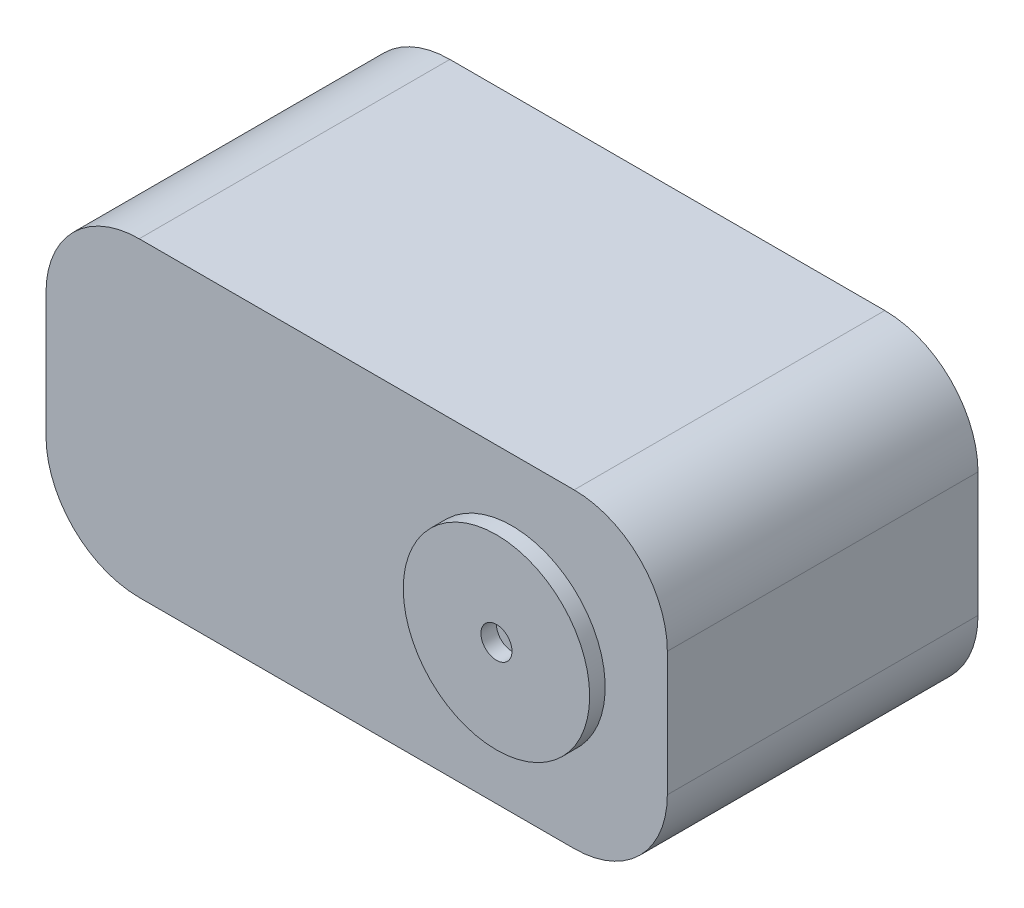
ISO-10303-21;
HEADER;
FILE_DESCRIPTION(('STEP AP214'),'2;1');
FILE_NAME('part.step','',(''),(''),'','','');
FILE_SCHEMA(('AUTOMOTIVE_DESIGN { 1 0 10303 214 1 1 1 1 }'));
ENDSEC;
DATA;
#1=APPLICATION_CONTEXT('core data for automotive mechanical design processes');
#2=APPLICATION_PROTOCOL_DEFINITION('international standard','automotive_design',2000,#1);
#3=PRODUCT_CONTEXT('',#1,'mechanical');
#4=PRODUCT('Part','Part','',(#3));
#5=PRODUCT_RELATED_PRODUCT_CATEGORY('part','',(#4));
#6=PRODUCT_DEFINITION_FORMATION('','',#4);
#7=PRODUCT_DEFINITION_CONTEXT('part definition',#1,'design');
#8=PRODUCT_DEFINITION('design','',#6,#7);
#9=PRODUCT_DEFINITION_SHAPE('','',#8);
#10=(LENGTH_UNIT() NAMED_UNIT(*) SI_UNIT(.MILLI.,.METRE.));
#11=(NAMED_UNIT(*) PLANE_ANGLE_UNIT() SI_UNIT($,.RADIAN.));
#12=(NAMED_UNIT(*) SI_UNIT($,.STERADIAN.) SOLID_ANGLE_UNIT());
#13=UNCERTAINTY_MEASURE_WITH_UNIT(LENGTH_MEASURE(1.E-05),#10,'distance_accuracy_value','');
#14=(GEOMETRIC_REPRESENTATION_CONTEXT(3) GLOBAL_UNCERTAINTY_ASSIGNED_CONTEXT((#13)) GLOBAL_UNIT_ASSIGNED_CONTEXT((#10,
#11,#12)) REPRESENTATION_CONTEXT('',''));
#15=CARTESIAN_POINT('',(0.,0.,0.));
#16=DIRECTION('',(0.,0.,1.));
#17=DIRECTION('',(1.,0.,0.));
#18=AXIS2_PLACEMENT_3D('',#15,#16,#17);
#19=CARTESIAN_POINT('',(-17.7799999999999,12.7,25.4));
#20=DIRECTION('',(0.,1.,0.));
#21=DIRECTION('',(0.,0.,1.));
#22=AXIS2_PLACEMENT_3D('',#19,#20,#21);
#23=PLANE('',#22);
#24=DIRECTION('',(1.,0.,0.));
#25=VECTOR('',#24,1.);
#26=CARTESIAN_POINT('',(-17.7799999999999,12.7,0.));
#27=LINE('',#26,#25);
#28=CARTESIAN_POINT('',(-17.7799999999999,12.7,0.));
#29=VERTEX_POINT('',#28);
#30=CARTESIAN_POINT('',(17.7799999999999,12.7,0.));
#31=VERTEX_POINT('',#30);
#32=EDGE_CURVE('E134',#29,#31,#27,.T.);
#33=ORIENTED_EDGE('',*,*,#32,.F.);
#34=DIRECTION('',(0.,0.,-1.));
#35=VECTOR('',#34,1.);
#36=CARTESIAN_POINT('',(-17.7799999999999,12.7,25.4));
#37=LINE('',#36,#35);
#38=CARTESIAN_POINT('',(-17.7799999999999,12.7,25.4));
#39=VERTEX_POINT('',#38);
#40=EDGE_CURVE('E43',#39,#29,#37,.T.);
#41=ORIENTED_EDGE('',*,*,#40,.F.);
#42=DIRECTION('',(1.,0.,0.));
#43=VECTOR('',#42,1.);
#44=CARTESIAN_POINT('',(-17.7799999999999,12.7,25.4));
#45=LINE('',#44,#43);
#46=CARTESIAN_POINT('',(17.7799999999999,12.7,25.4));
#47=VERTEX_POINT('',#46);
#48=EDGE_CURVE('E153',#39,#47,#45,.T.);
#49=ORIENTED_EDGE('',*,*,#48,.T.);
#50=DIRECTION('',(0.,0.,-1.));
#51=VECTOR('',#50,1.);
#52=CARTESIAN_POINT('',(17.7799999999999,12.7,25.4));
#53=LINE('',#52,#51);
#54=EDGE_CURVE('E88',#47,#31,#53,.T.);
#55=ORIENTED_EDGE('',*,*,#54,.T.);
#56=EDGE_LOOP('',(#33,#41,#49,#55));
#57=FACE_BOUND('',#56,.T.);
#58=ADVANCED_FACE('F35',(#57),#23,.T.);
#59=CARTESIAN_POINT('',(-17.78,5.08,25.4));
#60=DIRECTION('',(0.,0.,-1.));
#61=DIRECTION('',(-1.,0.,0.));
#62=AXIS2_PLACEMENT_3D('',#59,#60,#61);
#63=CYLINDRICAL_SURFACE('',#62,7.62);
#64=CARTESIAN_POINT('',(-17.78,5.08,0.));
#65=DIRECTION('',(0.,0.,1.));
#66=DIRECTION('',(1.,0.,0.));
#67=AXIS2_PLACEMENT_3D('',#64,#65,#66);
#68=CIRCLE('',#67,7.62);
#69=CARTESIAN_POINT('',(-25.4,5.07999999999995,0.));
#70=VERTEX_POINT('',#69);
#71=EDGE_CURVE('E79',#29,#70,#68,.T.);
#72=ORIENTED_EDGE('',*,*,#71,.T.);
#73=DIRECTION('',(0.,0.,-1.));
#74=VECTOR('',#73,1.);
#75=CARTESIAN_POINT('',(-25.4,5.07999999999995,25.4));
#76=LINE('',#75,#74);
#77=CARTESIAN_POINT('',(-25.4,5.07999999999995,25.4));
#78=VERTEX_POINT('',#77);
#79=EDGE_CURVE('E121',#78,#70,#76,.T.);
#80=ORIENTED_EDGE('',*,*,#79,.F.);
#81=CARTESIAN_POINT('',(-17.78,5.08,25.4));
#82=DIRECTION('',(0.,0.,1.));
#83=DIRECTION('',(1.,0.,0.));
#84=AXIS2_PLACEMENT_3D('',#81,#82,#83);
#85=CIRCLE('',#84,7.62);
#86=EDGE_CURVE('E111',#39,#78,#85,.T.);
#87=ORIENTED_EDGE('',*,*,#86,.F.);
#88=ORIENTED_EDGE('',*,*,#40,.T.);
#89=EDGE_LOOP('',(#72,#80,#87,#88));
#90=FACE_BOUND('',#89,.T.);
#91=ADVANCED_FACE('F223',(#90),#63,.T.);
#92=CARTESIAN_POINT('',(-25.4,5.07999999999995,25.4));
#93=DIRECTION('',(1.,0.,0.));
#94=DIRECTION('',(0.,0.,-1.));
#95=AXIS2_PLACEMENT_3D('',#92,#93,#94);
#96=PLANE('',#95);
#97=DIRECTION('',(0.,-1.,0.));
#98=VECTOR('',#97,1.);
#99=CARTESIAN_POINT('',(-25.4,5.07999999999995,0.));
#100=LINE('',#99,#98);
#101=CARTESIAN_POINT('',(-25.4,-5.07999999999995,0.));
#102=VERTEX_POINT('',#101);
#103=EDGE_CURVE('E118',#70,#102,#100,.T.);
#104=ORIENTED_EDGE('',*,*,#103,.T.);
#105=DIRECTION('',(0.,0.,-1.));
#106=VECTOR('',#105,1.);
#107=CARTESIAN_POINT('',(-25.4,-5.07999999999995,25.4));
#108=LINE('',#107,#106);
#109=CARTESIAN_POINT('',(-25.4,-5.07999999999995,25.4));
#110=VERTEX_POINT('',#109);
#111=EDGE_CURVE('E115',#110,#102,#108,.T.);
#112=ORIENTED_EDGE('',*,*,#111,.F.);
#113=DIRECTION('',(0.,-1.,0.));
#114=VECTOR('',#113,1.);
#115=CARTESIAN_POINT('',(-25.4,5.07999999999995,25.4));
#116=LINE('',#115,#114);
#117=EDGE_CURVE('E104',#78,#110,#116,.T.);
#118=ORIENTED_EDGE('',*,*,#117,.F.);
#119=ORIENTED_EDGE('',*,*,#79,.T.);
#120=EDGE_LOOP('',(#104,#112,#118,#119));
#121=FACE_BOUND('',#120,.T.);
#122=ADVANCED_FACE('F116',(#121),#96,.F.);
#123=CARTESIAN_POINT('',(-17.78,-5.08,25.4));
#124=DIRECTION('',(0.,0.,-1.));
#125=DIRECTION('',(-1.,0.,0.));
#126=AXIS2_PLACEMENT_3D('',#123,#124,#125);
#127=CYLINDRICAL_SURFACE('',#126,7.62);
#128=CARTESIAN_POINT('',(-17.78,-5.08,0.));
#129=DIRECTION('',(0.,0.,1.));
#130=DIRECTION('',(1.,0.,0.));
#131=AXIS2_PLACEMENT_3D('',#128,#129,#130);
#132=CIRCLE('',#131,7.62);
#133=CARTESIAN_POINT('',(-17.7799999999999,-12.7,0.));
#134=VERTEX_POINT('',#133);
#135=EDGE_CURVE('E149',#102,#134,#132,.T.);
#136=ORIENTED_EDGE('',*,*,#135,.T.);
#137=DIRECTION('',(0.,0.,-1.));
#138=VECTOR('',#137,1.);
#139=CARTESIAN_POINT('',(-17.7799999999999,-12.7,25.4));
#140=LINE('',#139,#138);
#141=CARTESIAN_POINT('',(-17.7799999999999,-12.7,25.4));
#142=VERTEX_POINT('',#141);
#143=EDGE_CURVE('E122',#142,#134,#140,.T.);
#144=ORIENTED_EDGE('',*,*,#143,.F.);
#145=CARTESIAN_POINT('',(-17.78,-5.08,25.4));
#146=DIRECTION('',(0.,0.,1.));
#147=DIRECTION('',(1.,0.,0.));
#148=AXIS2_PLACEMENT_3D('',#145,#146,#147);
#149=CIRCLE('',#148,7.62);
#150=EDGE_CURVE('E109',#110,#142,#149,.T.);
#151=ORIENTED_EDGE('',*,*,#150,.F.);
#152=ORIENTED_EDGE('',*,*,#111,.T.);
#153=EDGE_LOOP('',(#136,#144,#151,#152));
#154=FACE_BOUND('',#153,.T.);
#155=ADVANCED_FACE('F124',(#154),#127,.T.);
#156=CARTESIAN_POINT('',(-17.7799999999999,-12.7,25.4));
#157=DIRECTION('',(0.,1.,0.));
#158=DIRECTION('',(-1.,0.,0.));
#159=AXIS2_PLACEMENT_3D('',#156,#157,#158);
#160=PLANE('',#159);
#161=DIRECTION('',(1.,0.,0.));
#162=VECTOR('',#161,1.);
#163=CARTESIAN_POINT('',(-17.7799999999999,-12.7,0.));
#164=LINE('',#163,#162);
#165=CARTESIAN_POINT('',(17.7799999999999,-12.7,0.));
#166=VERTEX_POINT('',#165);
#167=EDGE_CURVE('E147',#134,#166,#164,.T.);
#168=ORIENTED_EDGE('',*,*,#167,.T.);
#169=DIRECTION('',(0.,0.,-1.));
#170=VECTOR('',#169,1.);
#171=CARTESIAN_POINT('',(17.7799999999999,-12.7,25.4));
#172=LINE('',#171,#170);
#173=CARTESIAN_POINT('',(17.7799999999999,-12.7,25.4));
#174=VERTEX_POINT('',#173);
#175=EDGE_CURVE('E157',#174,#166,#172,.T.);
#176=ORIENTED_EDGE('',*,*,#175,.F.);
#177=DIRECTION('',(1.,0.,0.));
#178=VECTOR('',#177,1.);
#179=CARTESIAN_POINT('',(-17.7799999999999,-12.7,25.4));
#180=LINE('',#179,#178);
#181=EDGE_CURVE('E127',#142,#174,#180,.T.);
#182=ORIENTED_EDGE('',*,*,#181,.F.);
#183=ORIENTED_EDGE('',*,*,#143,.T.);
#184=EDGE_LOOP('',(#168,#176,#182,#183));
#185=FACE_BOUND('',#184,.T.);
#186=ADVANCED_FACE('F170',(#185),#160,.F.);
#187=CARTESIAN_POINT('',(17.78,-5.08,25.4));
#188=DIRECTION('',(0.,0.,-1.));
#189=DIRECTION('',(-1.,0.,0.));
#190=AXIS2_PLACEMENT_3D('',#187,#188,#189);
#191=CYLINDRICAL_SURFACE('',#190,7.62);
#192=CARTESIAN_POINT('',(17.78,-5.08,0.));
#193=DIRECTION('',(0.,0.,1.));
#194=DIRECTION('',(1.,0.,0.));
#195=AXIS2_PLACEMENT_3D('',#192,#193,#194);
#196=CIRCLE('',#195,7.62);
#197=CARTESIAN_POINT('',(25.4,-5.08,0.));
#198=VERTEX_POINT('',#197);
#199=EDGE_CURVE('E144',#166,#198,#196,.T.);
#200=ORIENTED_EDGE('',*,*,#199,.T.);
#201=DIRECTION('',(0.,0.,-1.));
#202=VECTOR('',#201,1.);
#203=CARTESIAN_POINT('',(25.4,-5.08,25.4));
#204=LINE('',#203,#202);
#205=CARTESIAN_POINT('',(25.4,-5.08,25.4));
#206=VERTEX_POINT('',#205);
#207=EDGE_CURVE('E160',#206,#198,#204,.T.);
#208=ORIENTED_EDGE('',*,*,#207,.F.);
#209=CARTESIAN_POINT('',(17.78,-5.08,25.4));
#210=DIRECTION('',(0.,0.,1.));
#211=DIRECTION('',(1.,0.,0.));
#212=AXIS2_PLACEMENT_3D('',#209,#210,#211);
#213=CIRCLE('',#212,7.62);
#214=EDGE_CURVE('E129',#174,#206,#213,.T.);
#215=ORIENTED_EDGE('',*,*,#214,.F.);
#216=ORIENTED_EDGE('',*,*,#175,.T.);
#217=EDGE_LOOP('',(#200,#208,#215,#216));
#218=FACE_BOUND('',#217,.T.);
#219=ADVANCED_FACE('F178',(#218),#191,.T.);
#220=CARTESIAN_POINT('',(25.4,5.07999999999995,25.4));
#221=DIRECTION('',(1.,0.,0.));
#222=DIRECTION('',(0.,0.,-1.));
#223=AXIS2_PLACEMENT_3D('',#220,#221,#222);
#224=PLANE('',#223);
#225=DIRECTION('',(0.,-1.,0.));
#226=VECTOR('',#225,1.);
#227=CARTESIAN_POINT('',(25.4,5.07999999999995,0.));
#228=LINE('',#227,#226);
#229=CARTESIAN_POINT('',(25.4,5.07999999999995,0.));
#230=VERTEX_POINT('',#229);
#231=EDGE_CURVE('E141',#230,#198,#228,.T.);
#232=ORIENTED_EDGE('',*,*,#231,.F.);
#233=DIRECTION('',(0.,0.,-1.));
#234=VECTOR('',#233,1.);
#235=CARTESIAN_POINT('',(25.4,5.07999999999995,25.4));
#236=LINE('',#235,#234);
#237=CARTESIAN_POINT('',(25.4,5.07999999999995,25.4));
#238=VERTEX_POINT('',#237);
#239=EDGE_CURVE('E162',#238,#230,#236,.T.);
#240=ORIENTED_EDGE('',*,*,#239,.F.);
#241=DIRECTION('',(0.,-1.,0.));
#242=VECTOR('',#241,1.);
#243=CARTESIAN_POINT('',(25.4,5.07999999999995,25.4));
#244=LINE('',#243,#242);
#245=EDGE_CURVE('E176',#238,#206,#244,.T.);
#246=ORIENTED_EDGE('',*,*,#245,.T.);
#247=ORIENTED_EDGE('',*,*,#207,.T.);
#248=EDGE_LOOP('',(#232,#240,#246,#247));
#249=FACE_BOUND('',#248,.T.);
#250=ADVANCED_FACE('F180',(#249),#224,.T.);
#251=CARTESIAN_POINT('',(17.78,5.08,25.4));
#252=DIRECTION('',(0.,0.,-1.));
#253=DIRECTION('',(-1.,0.,0.));
#254=AXIS2_PLACEMENT_3D('',#251,#252,#253);
#255=CYLINDRICAL_SURFACE('',#254,7.62);
#256=CARTESIAN_POINT('',(17.78,5.08,0.));
#257=DIRECTION('',(0.,0.,-1.));
#258=DIRECTION('',(-1.,0.,0.));
#259=AXIS2_PLACEMENT_3D('',#256,#257,#258);
#260=CIRCLE('',#259,7.62);
#261=EDGE_CURVE('E137',#31,#230,#260,.T.);
#262=ORIENTED_EDGE('',*,*,#261,.F.);
#263=ORIENTED_EDGE('',*,*,#54,.F.);
#264=CARTESIAN_POINT('',(17.78,5.08,25.4));
#265=DIRECTION('',(0.,0.,-1.));
#266=DIRECTION('',(-1.,0.,0.));
#267=AXIS2_PLACEMENT_3D('',#264,#265,#266);
#268=CIRCLE('',#267,7.62);
#269=EDGE_CURVE('E181',#47,#238,#268,.T.);
#270=ORIENTED_EDGE('',*,*,#269,.T.);
#271=ORIENTED_EDGE('',*,*,#239,.T.);
#272=EDGE_LOOP('',(#262,#263,#270,#271));
#273=FACE_BOUND('',#272,.T.);
#274=ADVANCED_FACE('F163',(#273),#255,.T.);
#275=CARTESIAN_POINT('',(17.78,5.08,25.4));
#276=DIRECTION('',(0.,0.,-1.));
#277=DIRECTION('',(-1.,0.,0.));
#278=AXIS2_PLACEMENT_3D('',#275,#276,#277);
#279=PLANE('',#278);
#280=CARTESIAN_POINT('',(12.7,0.,25.4));
#281=DIRECTION('',(0.,0.,-1.));
#282=DIRECTION('',(-1.,0.,0.));
#283=AXIS2_PLACEMENT_3D('',#280,#281,#282);
#284=CIRCLE('',#283,7.62);
#285=CARTESIAN_POINT('',(5.08,0.,25.4));
#286=VERTEX_POINT('',#285);
#287=EDGE_CURVE('E11',#286,#286,#284,.F.);
#288=ORIENTED_EDGE('',*,*,#287,.F.);
#289=EDGE_LOOP('',(#288));
#290=FACE_BOUND('',#289,.T.);
#291=ORIENTED_EDGE('',*,*,#48,.F.);
#292=ORIENTED_EDGE('',*,*,#86,.T.);
#293=ORIENTED_EDGE('',*,*,#117,.T.);
#294=ORIENTED_EDGE('',*,*,#150,.T.);
#295=ORIENTED_EDGE('',*,*,#181,.T.);
#296=ORIENTED_EDGE('',*,*,#214,.T.);
#297=ORIENTED_EDGE('',*,*,#245,.F.);
#298=ORIENTED_EDGE('',*,*,#269,.F.);
#299=EDGE_LOOP('',(#291,#292,#293,#294,#295,#296,#297,#298));
#300=FACE_BOUND('',#299,.T.);
#301=ADVANCED_FACE('F107',(#290,#300),#279,.F.);
#302=CARTESIAN_POINT('',(17.78,5.08,0.));
#303=DIRECTION('',(0.,0.,-1.));
#304=DIRECTION('',(-1.,0.,0.));
#305=AXIS2_PLACEMENT_3D('',#302,#303,#304);
#306=PLANE('',#305);
#307=ORIENTED_EDGE('',*,*,#32,.T.);
#308=ORIENTED_EDGE('',*,*,#261,.T.);
#309=ORIENTED_EDGE('',*,*,#231,.T.);
#310=ORIENTED_EDGE('',*,*,#199,.F.);
#311=ORIENTED_EDGE('',*,*,#167,.F.);
#312=ORIENTED_EDGE('',*,*,#135,.F.);
#313=ORIENTED_EDGE('',*,*,#103,.F.);
#314=ORIENTED_EDGE('',*,*,#71,.F.);
#315=EDGE_LOOP('',(#307,#308,#309,#310,#311,#312,#313,#314));
#316=FACE_BOUND('',#315,.T.);
#317=ADVANCED_FACE('F166',(#316),#306,.T.);
#318=CARTESIAN_POINT('',(12.7,0.,26.67));
#319=DIRECTION('',(0.,0.,-1.));
#320=DIRECTION('',(-1.,0.,0.));
#321=AXIS2_PLACEMENT_3D('',#318,#319,#320);
#322=CYLINDRICAL_SURFACE('',#321,7.62);
#323=CARTESIAN_POINT('',(12.7,0.,26.67));
#324=DIRECTION('',(0.,0.,1.));
#325=DIRECTION('',(1.,0.,0.));
#326=AXIS2_PLACEMENT_3D('',#323,#324,#325);
#327=CIRCLE('',#326,7.62);
#328=CARTESIAN_POINT('',(20.32,0.,26.67));
#329=VERTEX_POINT('',#328);
#330=EDGE_CURVE('E138',#329,#329,#327,.T.);
#331=ORIENTED_EDGE('',*,*,#330,.F.);
#332=EDGE_LOOP('',(#331));
#333=FACE_BOUND('',#332,.T.);
#334=ORIENTED_EDGE('',*,*,#287,.T.);
#335=EDGE_LOOP('',(#334));
#336=FACE_BOUND('',#335,.T.);
#337=ADVANCED_FACE('F206',(#333,#336),#322,.T.);
#338=CARTESIAN_POINT('',(12.7,0.,26.67));
#339=DIRECTION('',(0.,0.,1.));
#340=DIRECTION('',(1.,0.,0.));
#341=AXIS2_PLACEMENT_3D('',#338,#339,#340);
#342=PLANE('',#341);
#343=CARTESIAN_POINT('',(12.7,0.,26.67));
#344=DIRECTION('',(0.,0.,1.));
#345=DIRECTION('',(1.,0.,0.));
#346=AXIS2_PLACEMENT_3D('',#343,#344,#345);
#347=CIRCLE('',#346,1.27);
#348=CARTESIAN_POINT('',(13.97,0.,26.67));
#349=VERTEX_POINT('',#348);
#350=EDGE_CURVE('E189',#349,#349,#347,.T.);
#351=ORIENTED_EDGE('',*,*,#350,.F.);
#352=EDGE_LOOP('',(#351));
#353=FACE_BOUND('',#352,.T.);
#354=ORIENTED_EDGE('',*,*,#330,.T.);
#355=EDGE_LOOP('',(#354));
#356=FACE_BOUND('',#355,.T.);
#357=ADVANCED_FACE('F200',(#353,#356),#342,.T.);
#358=CARTESIAN_POINT('',(12.7,0.,25.4));
#359=DIRECTION('',(0.,0.,1.));
#360=DIRECTION('',(1.,0.,0.));
#361=AXIS2_PLACEMENT_3D('',#358,#359,#360);
#362=CYLINDRICAL_SURFACE('',#361,1.27);
#363=CARTESIAN_POINT('',(12.7,0.,25.4));
#364=DIRECTION('',(0.,0.,1.));
#365=DIRECTION('',(1.,0.,0.));
#366=AXIS2_PLACEMENT_3D('',#363,#364,#365);
#367=CIRCLE('',#366,1.27);
#368=CARTESIAN_POINT('',(13.97,0.,25.4));
#369=VERTEX_POINT('',#368);
#370=EDGE_CURVE('E188',#369,#369,#367,.T.);
#371=ORIENTED_EDGE('',*,*,#370,.F.);
#372=EDGE_LOOP('',(#371));
#373=FACE_BOUND('',#372,.T.);
#374=ORIENTED_EDGE('',*,*,#350,.T.);
#375=EDGE_LOOP('',(#374));
#376=FACE_BOUND('',#375,.T.);
#377=ADVANCED_FACE('F197',(#373,#376),#362,.F.);
#378=CARTESIAN_POINT('',(12.7,0.,25.4));
#379=DIRECTION('',(0.,0.,1.));
#380=DIRECTION('',(1.,0.,0.));
#381=AXIS2_PLACEMENT_3D('',#378,#379,#380);
#382=PLANE('',#381);
#383=ORIENTED_EDGE('',*,*,#370,.T.);
#384=EDGE_LOOP('',(#383));
#385=FACE_BOUND('',#384,.T.);
#386=ADVANCED_FACE('F195',(#385),#382,.T.);
#387=CLOSED_SHELL('',(#58,#91,#122,#155,#186,#219,#250,#274,#301,#317,#337,#357,#377,#386));
#388=MANIFOLD_SOLID_BREP('B2',#387);
#389=ADVANCED_BREP_SHAPE_REPRESENTATION('',(#18,#388),#14);
#390=SHAPE_DEFINITION_REPRESENTATION(#9,#389);
ENDSEC;
END-ISO-10303-21;
